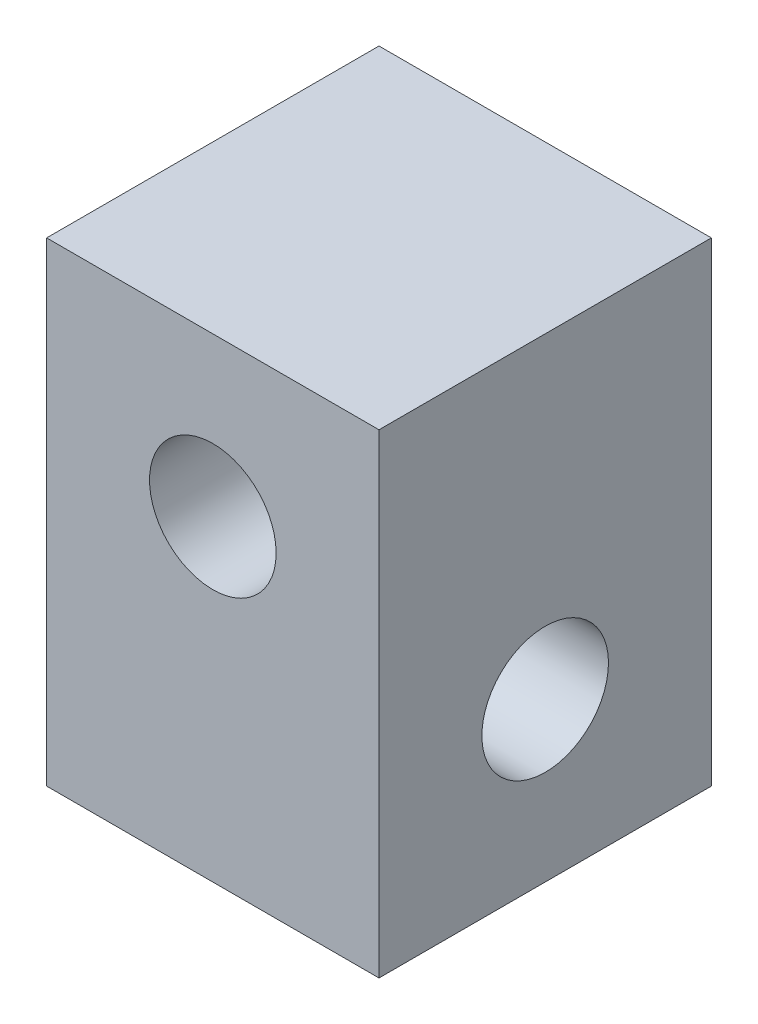
ISO-10303-21;
HEADER;
FILE_DESCRIPTION(('STEP AP214'),'2;1');
FILE_NAME('part.step','',(''),(''),'','','');
FILE_SCHEMA(('AUTOMOTIVE_DESIGN { 1 0 10303 214 1 1 1 1 }'));
ENDSEC;
DATA;
#1=APPLICATION_CONTEXT('core data for automotive mechanical design processes');
#2=APPLICATION_PROTOCOL_DEFINITION('international standard','automotive_design',2000,#1);
#3=PRODUCT_CONTEXT('',#1,'mechanical');
#4=PRODUCT('Part','Part','',(#3));
#5=PRODUCT_RELATED_PRODUCT_CATEGORY('part','',(#4));
#6=PRODUCT_DEFINITION_FORMATION('','',#4);
#7=PRODUCT_DEFINITION_CONTEXT('part definition',#1,'design');
#8=PRODUCT_DEFINITION('design','',#6,#7);
#9=PRODUCT_DEFINITION_SHAPE('','',#8);
#10=(LENGTH_UNIT() NAMED_UNIT(*) SI_UNIT(.MILLI.,.METRE.));
#11=(NAMED_UNIT(*) PLANE_ANGLE_UNIT() SI_UNIT($,.RADIAN.));
#12=(NAMED_UNIT(*) SI_UNIT($,.STERADIAN.) SOLID_ANGLE_UNIT());
#13=UNCERTAINTY_MEASURE_WITH_UNIT(LENGTH_MEASURE(1.E-05),#10,'distance_accuracy_value','');
#14=(GEOMETRIC_REPRESENTATION_CONTEXT(3) GLOBAL_UNCERTAINTY_ASSIGNED_CONTEXT((#13)) GLOBAL_UNIT_ASSIGNED_CONTEXT((#10,
#11,#12)) REPRESENTATION_CONTEXT('',''));
#15=CARTESIAN_POINT('',(0.,0.,0.));
#16=DIRECTION('',(0.,0.,1.));
#17=DIRECTION('',(1.,0.,0.));
#18=AXIS2_PLACEMENT_3D('',#15,#16,#17);
#19=CARTESIAN_POINT('',(10.5,30.,10.5));
#20=DIRECTION('',(-1.,0.,0.));
#21=DIRECTION('',(0.,0.,1.));
#22=AXIS2_PLACEMENT_3D('',#19,#20,#21);
#23=PLANE('',#22);
#24=CARTESIAN_POINT('',(10.5,10.,0.));
#25=DIRECTION('',(1.,0.,0.));
#26=DIRECTION('',(0.,0.,-1.));
#27=AXIS2_PLACEMENT_3D('',#24,#25,#26);
#28=CIRCLE('',#27,4.);
#29=CARTESIAN_POINT('',(10.5,10.,-4.));
#30=VERTEX_POINT('',#29);
#31=EDGE_CURVE('E134',#30,#30,#28,.T.);
#32=ORIENTED_EDGE('',*,*,#31,.F.);
#33=EDGE_LOOP('',(#32));
#34=FACE_BOUND('',#33,.T.);
#35=DIRECTION('',(0.,0.,-1.));
#36=VECTOR('',#35,1.);
#37=CARTESIAN_POINT('',(10.5,0.,10.5));
#38=LINE('',#37,#36);
#39=CARTESIAN_POINT('',(10.5,0.,10.5));
#40=VERTEX_POINT('',#39);
#41=CARTESIAN_POINT('',(10.5,0.,-10.5));
#42=VERTEX_POINT('',#41);
#43=EDGE_CURVE('E104',#40,#42,#38,.T.);
#44=ORIENTED_EDGE('',*,*,#43,.T.);
#45=DIRECTION('',(0.,-1.,0.));
#46=VECTOR('',#45,1.);
#47=CARTESIAN_POINT('',(10.5,30.,-10.5));
#48=LINE('',#47,#46);
#49=CARTESIAN_POINT('',(10.5,30.,-10.5));
#50=VERTEX_POINT('',#49);
#51=EDGE_CURVE('E11',#50,#42,#48,.T.);
#52=ORIENTED_EDGE('',*,*,#51,.F.);
#53=DIRECTION('',(0.,0.,-1.));
#54=VECTOR('',#53,1.);
#55=CARTESIAN_POINT('',(10.5,30.,10.5));
#56=LINE('',#55,#54);
#57=CARTESIAN_POINT('',(10.5,30.,10.5));
#58=VERTEX_POINT('',#57);
#59=EDGE_CURVE('E88',#58,#50,#56,.T.);
#60=ORIENTED_EDGE('',*,*,#59,.F.);
#61=DIRECTION('',(0.,-1.,0.));
#62=VECTOR('',#61,1.);
#63=CARTESIAN_POINT('',(10.5,30.,10.5));
#64=LINE('',#63,#62);
#65=EDGE_CURVE('E100',#58,#40,#64,.T.);
#66=ORIENTED_EDGE('',*,*,#65,.T.);
#67=EDGE_LOOP('',(#44,#52,#60,#66));
#68=FACE_BOUND('',#67,.T.);
#69=ADVANCED_FACE('F36',(#34,#68),#23,.F.);
#70=CARTESIAN_POINT('',(-10.5,30.,-10.5));
#71=DIRECTION('',(0.,0.,1.));
#72=DIRECTION('',(1.,0.,0.));
#73=AXIS2_PLACEMENT_3D('',#70,#71,#72);
#74=PLANE('',#73);
#75=CARTESIAN_POINT('',(0.,20.,-10.5));
#76=DIRECTION('',(0.,0.,1.));
#77=DIRECTION('',(1.,0.,0.));
#78=AXIS2_PLACEMENT_3D('',#75,#76,#77);
#79=CIRCLE('',#78,4.);
#80=CARTESIAN_POINT('',(4.,20.,-10.5));
#81=VERTEX_POINT('',#80);
#82=EDGE_CURVE('E108',#81,#81,#79,.T.);
#83=ORIENTED_EDGE('',*,*,#82,.T.);
#84=EDGE_LOOP('',(#83));
#85=FACE_BOUND('',#84,.T.);
#86=DIRECTION('',(-1.,0.,0.));
#87=VECTOR('',#86,1.);
#88=CARTESIAN_POINT('',(-10.5,0.,-10.5));
#89=LINE('',#88,#87);
#90=CARTESIAN_POINT('',(-10.5,0.,-10.5));
#91=VERTEX_POINT('',#90);
#92=EDGE_CURVE('E93',#42,#91,#89,.T.);
#93=ORIENTED_EDGE('',*,*,#92,.T.);
#94=DIRECTION('',(0.,-1.,0.));
#95=VECTOR('',#94,1.);
#96=CARTESIAN_POINT('',(-10.5,30.,-10.5));
#97=LINE('',#96,#95);
#98=CARTESIAN_POINT('',(-10.5,30.,-10.5));
#99=VERTEX_POINT('',#98);
#100=EDGE_CURVE('E45',#99,#91,#97,.T.);
#101=ORIENTED_EDGE('',*,*,#100,.F.);
#102=DIRECTION('',(-1.,0.,0.));
#103=VECTOR('',#102,1.);
#104=CARTESIAN_POINT('',(-10.5,30.,-10.5));
#105=LINE('',#104,#103);
#106=EDGE_CURVE('E83',#50,#99,#105,.T.);
#107=ORIENTED_EDGE('',*,*,#106,.F.);
#108=ORIENTED_EDGE('',*,*,#51,.T.);
#109=EDGE_LOOP('',(#93,#101,#107,#108));
#110=FACE_BOUND('',#109,.T.);
#111=ADVANCED_FACE('F92',(#85,#110),#74,.F.);
#112=CARTESIAN_POINT('',(-10.5,30.,10.5));
#113=DIRECTION('',(1.,0.,0.));
#114=DIRECTION('',(0.,0.,-1.));
#115=AXIS2_PLACEMENT_3D('',#112,#113,#114);
#116=PLANE('',#115);
#117=CARTESIAN_POINT('',(-10.5,10.,0.));
#118=DIRECTION('',(1.,0.,0.));
#119=DIRECTION('',(0.,0.,-1.));
#120=AXIS2_PLACEMENT_3D('',#117,#118,#119);
#121=CIRCLE('',#120,4.);
#122=CARTESIAN_POINT('',(-10.5,10.,-4.));
#123=VERTEX_POINT('',#122);
#124=EDGE_CURVE('E130',#123,#123,#121,.T.);
#125=ORIENTED_EDGE('',*,*,#124,.T.);
#126=EDGE_LOOP('',(#125));
#127=FACE_BOUND('',#126,.T.);
#128=DIRECTION('',(0.,0.,1.));
#129=VECTOR('',#128,1.);
#130=CARTESIAN_POINT('',(-10.5,0.,10.5));
#131=LINE('',#130,#129);
#132=CARTESIAN_POINT('',(-10.5,0.,10.5));
#133=VERTEX_POINT('',#132);
#134=EDGE_CURVE('E70',#91,#133,#131,.T.);
#135=ORIENTED_EDGE('',*,*,#134,.T.);
#136=DIRECTION('',(0.,-1.,0.));
#137=VECTOR('',#136,1.);
#138=CARTESIAN_POINT('',(-10.5,30.,10.5));
#139=LINE('',#138,#137);
#140=CARTESIAN_POINT('',(-10.5,30.,10.5));
#141=VERTEX_POINT('',#140);
#142=EDGE_CURVE('E95',#141,#133,#139,.T.);
#143=ORIENTED_EDGE('',*,*,#142,.F.);
#144=DIRECTION('',(0.,0.,1.));
#145=VECTOR('',#144,1.);
#146=CARTESIAN_POINT('',(-10.5,30.,10.5));
#147=LINE('',#146,#145);
#148=EDGE_CURVE('E86',#99,#141,#147,.T.);
#149=ORIENTED_EDGE('',*,*,#148,.F.);
#150=ORIENTED_EDGE('',*,*,#100,.T.);
#151=EDGE_LOOP('',(#135,#143,#149,#150));
#152=FACE_BOUND('',#151,.T.);
#153=ADVANCED_FACE('F96',(#127,#152),#116,.F.);
#154=CARTESIAN_POINT('',(-10.5,30.,10.5));
#155=DIRECTION('',(0.,0.,-1.));
#156=DIRECTION('',(-1.,0.,0.));
#157=AXIS2_PLACEMENT_3D('',#154,#155,#156);
#158=PLANE('',#157);
#159=CARTESIAN_POINT('',(0.,20.,10.5));
#160=DIRECTION('',(0.,0.,1.));
#161=DIRECTION('',(1.,0.,0.));
#162=AXIS2_PLACEMENT_3D('',#159,#160,#161);
#163=CIRCLE('',#162,4.);
#164=CARTESIAN_POINT('',(4.,20.,10.5));
#165=VERTEX_POINT('',#164);
#166=EDGE_CURVE('E126',#165,#165,#163,.T.);
#167=ORIENTED_EDGE('',*,*,#166,.F.);
#168=EDGE_LOOP('',(#167));
#169=FACE_BOUND('',#168,.T.);
#170=DIRECTION('',(1.,0.,0.));
#171=VECTOR('',#170,1.);
#172=CARTESIAN_POINT('',(-10.5,0.,10.5));
#173=LINE('',#172,#171);
#174=EDGE_CURVE('E76',#133,#40,#173,.T.);
#175=ORIENTED_EDGE('',*,*,#174,.T.);
#176=ORIENTED_EDGE('',*,*,#65,.F.);
#177=DIRECTION('',(1.,0.,0.));
#178=VECTOR('',#177,1.);
#179=CARTESIAN_POINT('',(-10.5,30.,10.5));
#180=LINE('',#179,#178);
#181=EDGE_CURVE('E53',#141,#58,#180,.T.);
#182=ORIENTED_EDGE('',*,*,#181,.F.);
#183=ORIENTED_EDGE('',*,*,#142,.T.);
#184=EDGE_LOOP('',(#175,#176,#182,#183));
#185=FACE_BOUND('',#184,.T.);
#186=ADVANCED_FACE('F118',(#169,#185),#158,.F.);
#187=CARTESIAN_POINT('',(0.,30.,0.));
#188=DIRECTION('',(0.,-1.,0.));
#189=DIRECTION('',(0.,0.,-1.));
#190=AXIS2_PLACEMENT_3D('',#187,#188,#189);
#191=PLANE('',#190);
#192=ORIENTED_EDGE('',*,*,#59,.T.);
#193=ORIENTED_EDGE('',*,*,#106,.T.);
#194=ORIENTED_EDGE('',*,*,#148,.T.);
#195=ORIENTED_EDGE('',*,*,#181,.T.);
#196=EDGE_LOOP('',(#192,#193,#194,#195));
#197=FACE_BOUND('',#196,.T.);
#198=ADVANCED_FACE('F84',(#197),#191,.F.);
#199=CARTESIAN_POINT('',(0.,0.,0.));
#200=DIRECTION('',(0.,-1.,0.));
#201=DIRECTION('',(0.,0.,-1.));
#202=AXIS2_PLACEMENT_3D('',#199,#200,#201);
#203=PLANE('',#202);
#204=ORIENTED_EDGE('',*,*,#43,.F.);
#205=ORIENTED_EDGE('',*,*,#174,.F.);
#206=ORIENTED_EDGE('',*,*,#134,.F.);
#207=ORIENTED_EDGE('',*,*,#92,.F.);
#208=EDGE_LOOP('',(#204,#205,#206,#207));
#209=FACE_BOUND('',#208,.T.);
#210=ADVANCED_FACE('F121',(#209),#203,.T.);
#211=CARTESIAN_POINT('',(0.,20.,-10.5));
#212=DIRECTION('',(0.,0.,1.));
#213=DIRECTION('',(1.,0.,0.));
#214=AXIS2_PLACEMENT_3D('',#211,#212,#213);
#215=CYLINDRICAL_SURFACE('',#214,4.);
#216=CARTESIAN_POINT('',(4.,20.,-10.5));
#217=CARTESIAN_POINT('',(4.,20.,-10.28125));
#218=CARTESIAN_POINT('',(4.,20.,-10.0625));
#219=CARTESIAN_POINT('',(4.,20.,-9.625));
#220=CARTESIAN_POINT('',(4.,20.,-9.40625));
#221=CARTESIAN_POINT('',(4.,20.,-8.96875));
#222=CARTESIAN_POINT('',(4.,20.,-8.75));
#223=CARTESIAN_POINT('',(4.,20.,-8.3125));
#224=CARTESIAN_POINT('',(4.,20.,-8.09375));
#225=CARTESIAN_POINT('',(4.,20.,-7.65625));
#226=CARTESIAN_POINT('',(4.,20.,-7.4375));
#227=CARTESIAN_POINT('',(4.,20.,-7.));
#228=CARTESIAN_POINT('',(4.,20.,-6.78125));
#229=CARTESIAN_POINT('',(4.,20.,-6.34375));
#230=CARTESIAN_POINT('',(4.,20.,-6.125));
#231=CARTESIAN_POINT('',(4.,20.,-5.6875));
#232=CARTESIAN_POINT('',(4.,20.,-5.46875));
#233=CARTESIAN_POINT('',(4.,20.,-5.03125));
#234=CARTESIAN_POINT('',(4.,20.,-4.8125));
#235=CARTESIAN_POINT('',(4.,20.,-4.375));
#236=CARTESIAN_POINT('',(4.,20.,-4.15625));
#237=CARTESIAN_POINT('',(4.,20.,-3.71875));
#238=CARTESIAN_POINT('',(4.,20.,-3.5));
#239=CARTESIAN_POINT('',(4.,20.,-3.0625));
#240=CARTESIAN_POINT('',(4.,20.,-2.84375));
#241=CARTESIAN_POINT('',(4.,20.,-2.40625));
#242=CARTESIAN_POINT('',(4.,20.,-2.1875));
#243=CARTESIAN_POINT('',(4.,20.,-1.75));
#244=CARTESIAN_POINT('',(4.,20.,-1.53125));
#245=CARTESIAN_POINT('',(4.,20.,-1.09375));
#246=CARTESIAN_POINT('',(4.,20.,-0.875000000000003));
#247=CARTESIAN_POINT('',(4.,20.,-0.437500000000002));
#248=CARTESIAN_POINT('',(4.,20.,-0.218750000000002));
#249=CARTESIAN_POINT('',(4.,20.,0.218749999999998));
#250=CARTESIAN_POINT('',(4.,20.,0.437499999999999));
#251=CARTESIAN_POINT('',(4.,20.,0.874999999999999));
#252=CARTESIAN_POINT('',(4.,20.,1.09375));
#253=CARTESIAN_POINT('',(4.,20.,1.53125));
#254=CARTESIAN_POINT('',(4.,20.,1.75));
#255=CARTESIAN_POINT('',(4.,20.,2.1875));
#256=CARTESIAN_POINT('',(4.,20.,2.40625));
#257=CARTESIAN_POINT('',(4.,20.,2.84375));
#258=CARTESIAN_POINT('',(4.,20.,3.0625));
#259=CARTESIAN_POINT('',(4.,20.,3.5));
#260=CARTESIAN_POINT('',(4.,20.,3.71875));
#261=CARTESIAN_POINT('',(4.,20.,4.15625));
#262=CARTESIAN_POINT('',(4.,20.,4.375));
#263=CARTESIAN_POINT('',(4.,20.,4.8125));
#264=CARTESIAN_POINT('',(4.,20.,5.03125));
#265=CARTESIAN_POINT('',(4.,20.,5.46875));
#266=CARTESIAN_POINT('',(4.,20.,5.6875));
#267=CARTESIAN_POINT('',(4.,20.,6.125));
#268=CARTESIAN_POINT('',(4.,20.,6.34375));
#269=CARTESIAN_POINT('',(4.,20.,6.78125));
#270=CARTESIAN_POINT('',(4.,20.,7.));
#271=CARTESIAN_POINT('',(4.,20.,7.4375));
#272=CARTESIAN_POINT('',(4.,20.,7.65625));
#273=CARTESIAN_POINT('',(4.,20.,8.09375));
#274=CARTESIAN_POINT('',(4.,20.,8.3125));
#275=CARTESIAN_POINT('',(4.,20.,8.75));
#276=CARTESIAN_POINT('',(4.,20.,8.96875));
#277=CARTESIAN_POINT('',(4.,20.,9.40625));
#278=CARTESIAN_POINT('',(4.,20.,9.625));
#279=CARTESIAN_POINT('',(4.,20.,10.0625));
#280=CARTESIAN_POINT('',(4.,20.,10.28125));
#281=CARTESIAN_POINT('',(4.,20.,10.5));
#282=B_SPLINE_CURVE_WITH_KNOTS('',3,(#216,#217,#218,#219,#220,#221,#222,#223,#224,#225,#226,
#227,#228,#229,#230,#231,#232,#233,#234,#235,#236,#237,#238,#239,#240,#241,#242,#243,#244,#245,
#246,#247,#248,#249,#250,#251,#252,#253,#254,#255,#256,#257,#258,#259,#260,#261,#262,#263,#264,
#265,#266,#267,#268,#269,#270,#271,#272,#273,#274,#275,#276,#277,#278,#279,#280,#281),
.UNSPECIFIED.,.F.,.F.,(4,2,2,2,2,2,2,2,2,2,2,2,2,2,2,2,2,2,2,2,2,2,2,2,2,2,2,2,2,2,2,2,4),(0.,
0.656249999999999,1.3125,1.96875,2.625,3.28125,3.9375,4.59375,5.25,5.90625,6.5625,7.21875,7.875,
8.53125,9.1875,9.84375,10.5,11.15625,11.8125,12.46875,13.125,13.78125,14.4375,15.09375,15.75,
16.40625,17.0625,17.71875,18.375,19.03125,19.6875,20.34375,21.),.UNSPECIFIED.);
#283=EDGE_CURVE('BSEAM145',#81,#165,#282,.T.);
#284=ORIENTED_EDGE('',*,*,#82,.F.);
#285=ORIENTED_EDGE('',*,*,#166,.T.);
#286=ORIENTED_EDGE('',*,*,#283,.T.);
#287=ORIENTED_EDGE('',*,*,#283,.F.);
#288=EDGE_LOOP('',(#284,#286,#285,#287));
#289=FACE_BOUND('',#288,.T.);
#290=ADVANCED_FACE('F145',(#289),#215,.F.);
#291=CARTESIAN_POINT('',(-10.5,10.,0.));
#292=DIRECTION('',(1.,0.,0.));
#293=DIRECTION('',(0.,0.,-1.));
#294=AXIS2_PLACEMENT_3D('',#291,#292,#293);
#295=CYLINDRICAL_SURFACE('',#294,4.);
#296=ORIENTED_EDGE('',*,*,#124,.F.);
#297=EDGE_LOOP('',(#296));
#298=FACE_BOUND('',#297,.T.);
#299=ORIENTED_EDGE('',*,*,#31,.T.);
#300=EDGE_LOOP('',(#299));
#301=FACE_BOUND('',#300,.T.);
#302=ADVANCED_FACE('F142',(#298,#301),#295,.F.);
#303=CLOSED_SHELL('',(#69,#111,#153,#186,#198,#210,#290,#302));
#304=MANIFOLD_SOLID_BREP('B2',#303);
#305=ADVANCED_BREP_SHAPE_REPRESENTATION('',(#18,#304),#14);
#306=SHAPE_DEFINITION_REPRESENTATION(#9,#305);
ENDSEC;
END-ISO-10303-21;
